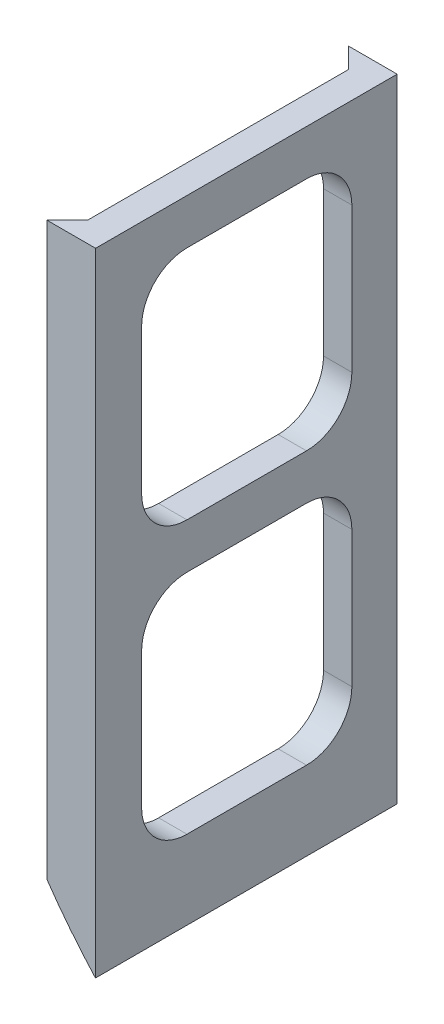
ISO-10303-21;
HEADER;
FILE_DESCRIPTION(('STEP AP214'),'2;1');
FILE_NAME('part.step','',(''),(''),'','','');
FILE_SCHEMA(('AUTOMOTIVE_DESIGN { 1 0 10303 214 1 1 1 1 }'));
ENDSEC;
DATA;
#1=APPLICATION_CONTEXT('core data for automotive mechanical design processes');
#2=APPLICATION_PROTOCOL_DEFINITION('international standard','automotive_design',2000,#1);
#3=PRODUCT_CONTEXT('',#1,'mechanical');
#4=PRODUCT('Part','Part','',(#3));
#5=PRODUCT_RELATED_PRODUCT_CATEGORY('part','',(#4));
#6=PRODUCT_DEFINITION_FORMATION('','',#4);
#7=PRODUCT_DEFINITION_CONTEXT('part definition',#1,'design');
#8=PRODUCT_DEFINITION('design','',#6,#7);
#9=PRODUCT_DEFINITION_SHAPE('','',#8);
#10=(LENGTH_UNIT() NAMED_UNIT(*) SI_UNIT(.MILLI.,.METRE.));
#11=(NAMED_UNIT(*) PLANE_ANGLE_UNIT() SI_UNIT($,.RADIAN.));
#12=(NAMED_UNIT(*) SI_UNIT($,.STERADIAN.) SOLID_ANGLE_UNIT());
#13=UNCERTAINTY_MEASURE_WITH_UNIT(LENGTH_MEASURE(1.E-05),#10,'distance_accuracy_value','');
#14=(GEOMETRIC_REPRESENTATION_CONTEXT(3) GLOBAL_UNCERTAINTY_ASSIGNED_CONTEXT((#13)) GLOBAL_UNIT_ASSIGNED_CONTEXT((#10,
#11,#12)) REPRESENTATION_CONTEXT('',''));
#15=CARTESIAN_POINT('',(0.,0.,0.));
#16=DIRECTION('',(0.,0.,1.));
#17=DIRECTION('',(1.,0.,0.));
#18=AXIS2_PLACEMENT_3D('',#15,#16,#17);
#19=CARTESIAN_POINT('',(0.,108.226514235445,0.));
#20=DIRECTION('',(0.,0.,-1.));
#21=DIRECTION('',(-1.,0.,0.));
#22=AXIS2_PLACEMENT_3D('',#19,#20,#21);
#23=PLANE('',#22);
#24=DIRECTION('',(0.,1.,0.));
#25=VECTOR('',#24,1.);
#26=CARTESIAN_POINT('',(39.4579888677549,108.226514235445,0.));
#27=LINE('',#26,#25);
#28=CARTESIAN_POINT('',(39.4579888677549,111.166966133927,0.));
#29=VERTEX_POINT('',#28);
#30=CARTESIAN_POINT('',(39.4579888677549,111.179894523592,0.));
#31=VERTEX_POINT('',#30);
#32=EDGE_CURVE('E277',#29,#31,#27,.T.);
#33=ORIENTED_EDGE('',*,*,#32,.F.);
#34=CARTESIAN_POINT('',(78.9720678383896,141.993156821472,0.));
#35=DIRECTION('',(0.,0.,-1.));
#36=DIRECTION('',(-1.,0.,0.));
#37=AXIS2_PLACEMENT_3D('',#34,#35,#36);
#38=CIRCLE('',#37,50.1160300622708);
#39=CARTESIAN_POINT('',(41.9392402705418,108.226514235445,0.));
#40=VERTEX_POINT('',#39);
#41=EDGE_CURVE('E466',#29,#40,#38,.F.);
#42=ORIENTED_EDGE('',*,*,#41,.T.);
#43=DIRECTION('',(-1.,0.,0.));
#44=VECTOR('',#43,1.);
#45=CARTESIAN_POINT('',(0.,108.226514235445,0.));
#46=LINE('',#45,#44);
#47=CARTESIAN_POINT('',(41.9572648481414,108.226514235445,0.));
#48=VERTEX_POINT('',#47);
#49=EDGE_CURVE('E263',#48,#40,#46,.T.);
#50=ORIENTED_EDGE('',*,*,#49,.F.);
#51=CARTESIAN_POINT('',(78.8744346483331,142.001580020937,0.));
#52=DIRECTION('',(0.,0.,1.));
#53=DIRECTION('',(1.,0.,0.));
#54=AXIS2_PLACEMENT_3D('',#51,#52,#53);
#55=CIRCLE('',#54,50.0363117632635);
#56=EDGE_CURVE('E296',#31,#48,#55,.T.);
#57=ORIENTED_EDGE('',*,*,#56,.F.);
#58=EDGE_LOOP('',(#33,#42,#50,#57));
#59=FACE_BOUND('',#58,.T.);
#60=ADVANCED_FACE('F41',(#59),#23,.F.);
#61=CARTESIAN_POINT('',(0.,108.226514235445,-1.79999999999999));
#62=DIRECTION('',(0.,0.,-1.));
#63=DIRECTION('',(-1.,0.,0.));
#64=AXIS2_PLACEMENT_3D('',#61,#62,#63);
#65=PLANE('',#64);
#66=CARTESIAN_POINT('',(78.9720678383896,141.993156821472,-1.8));
#67=DIRECTION('',(0.,0.,-1.));
#68=DIRECTION('',(1.,0.,0.));
#69=AXIS2_PLACEMENT_3D('',#66,#67,#68);
#70=CIRCLE('',#69,50.1160300622708);
#71=CARTESIAN_POINT('',(41.9392402705418,108.226514235445,-1.8));
#72=VERTEX_POINT('',#71);
#73=CARTESIAN_POINT('',(37.6579888677549,113.624805653126,-1.8));
#74=VERTEX_POINT('',#73);
#75=EDGE_CURVE('E58',#72,#74,#70,.T.);
#76=ORIENTED_EDGE('',*,*,#75,.T.);
#77=DIRECTION('',(0.,1.,0.));
#78=VECTOR('',#77,1.);
#79=CARTESIAN_POINT('',(37.6579888677549,108.226514235445,-1.8));
#80=LINE('',#79,#78);
#81=CARTESIAN_POINT('',(37.6579888677549,163.966514235445,-1.8));
#82=VERTEX_POINT('',#81);
#83=EDGE_CURVE('E280',#74,#82,#80,.T.);
#84=ORIENTED_EDGE('',*,*,#83,.T.);
#85=DIRECTION('',(-1.,0.,0.));
#86=VECTOR('',#85,1.);
#87=CARTESIAN_POINT('',(0.,163.966514235445,-1.79999999999999));
#88=LINE('',#87,#86);
#89=CARTESIAN_POINT('',(41.957988867755,163.966514235445,-1.8));
#90=VERTEX_POINT('',#89);
#91=EDGE_CURVE('E270',#90,#82,#88,.T.);
#92=ORIENTED_EDGE('',*,*,#91,.F.);
#93=DIRECTION('',(0.,1.,0.));
#94=VECTOR('',#93,1.);
#95=CARTESIAN_POINT('',(41.957988867755,108.226514235445,-1.8));
#96=LINE('',#95,#94);
#97=CARTESIAN_POINT('',(41.957988867755,108.226514235445,-1.8));
#98=VERTEX_POINT('',#97);
#99=EDGE_CURVE('E269',#98,#90,#96,.T.);
#100=ORIENTED_EDGE('',*,*,#99,.F.);
#101=DIRECTION('',(-1.,0.,0.));
#102=VECTOR('',#101,1.);
#103=CARTESIAN_POINT('',(0.,108.226514235445,-1.79999999999999));
#104=LINE('',#103,#102);
#105=EDGE_CURVE('E266',#98,#72,#104,.T.);
#106=ORIENTED_EDGE('',*,*,#105,.T.);
#107=EDGE_LOOP('',(#76,#84,#92,#100,#106));
#108=FACE_BOUND('',#107,.T.);
#109=ADVANCED_FACE('F477',(#108),#65,.T.);
#110=CARTESIAN_POINT('',(0.,108.226514235445,23.));
#111=DIRECTION('',(0.,0.,1.));
#112=DIRECTION('',(1.,0.,0.));
#113=AXIS2_PLACEMENT_3D('',#110,#111,#112);
#114=PLANE('',#113);
#115=DIRECTION('',(1.,0.,0.));
#116=VECTOR('',#115,1.);
#117=CARTESIAN_POINT('',(0.,108.226514235445,23.));
#118=LINE('',#117,#116);
#119=CARTESIAN_POINT('',(41.9392402705418,108.226514235445,23.));
#120=VERTEX_POINT('',#119);
#121=CARTESIAN_POINT('',(41.9572648481414,108.226514235445,23.));
#122=VERTEX_POINT('',#121);
#123=EDGE_CURVE('E255',#120,#122,#118,.T.);
#124=ORIENTED_EDGE('',*,*,#123,.F.);
#125=CARTESIAN_POINT('',(78.9720678383896,141.993156821472,23.));
#126=DIRECTION('',(0.,0.,1.));
#127=DIRECTION('',(1.,0.,0.));
#128=AXIS2_PLACEMENT_3D('',#125,#126,#127);
#129=CIRCLE('',#128,50.1160300622708);
#130=CARTESIAN_POINT('',(39.4579888677549,111.166966133927,23.));
#131=VERTEX_POINT('',#130);
#132=EDGE_CURVE('E66',#120,#131,#129,.F.);
#133=ORIENTED_EDGE('',*,*,#132,.T.);
#134=DIRECTION('',(0.,1.,0.));
#135=VECTOR('',#134,1.);
#136=CARTESIAN_POINT('',(39.4579888677549,108.226514235445,23.));
#137=LINE('',#136,#135);
#138=CARTESIAN_POINT('',(39.4579888677549,111.179894523592,23.));
#139=VERTEX_POINT('',#138);
#140=EDGE_CURVE('E239',#131,#139,#137,.T.);
#141=ORIENTED_EDGE('',*,*,#140,.T.);
#142=CARTESIAN_POINT('',(78.8744346483331,142.001580020937,23.));
#143=DIRECTION('',(0.,0.,1.));
#144=DIRECTION('',(1.,0.,0.));
#145=AXIS2_PLACEMENT_3D('',#142,#143,#144);
#146=CIRCLE('',#145,50.0363117632635);
#147=EDGE_CURVE('E288',#139,#122,#146,.T.);
#148=ORIENTED_EDGE('',*,*,#147,.T.);
#149=EDGE_LOOP('',(#124,#133,#141,#148));
#150=FACE_BOUND('',#149,.T.);
#151=ADVANCED_FACE('F515',(#150),#114,.F.);
#152=CARTESIAN_POINT('',(0.,108.226514235445,24.8));
#153=DIRECTION('',(0.,0.,-1.));
#154=DIRECTION('',(-1.,0.,0.));
#155=AXIS2_PLACEMENT_3D('',#152,#153,#154);
#156=PLANE('',#155);
#157=DIRECTION('',(0.,1.,0.));
#158=VECTOR('',#157,1.);
#159=CARTESIAN_POINT('',(37.6579888677549,108.226514235445,24.8));
#160=LINE('',#159,#158);
#161=CARTESIAN_POINT('',(37.6579866963459,113.624815972354,24.8000021714091));
#162=VERTEX_POINT('',#161);
#163=CARTESIAN_POINT('',(37.6579888677549,163.966514235445,24.8));
#164=VERTEX_POINT('',#163);
#165=EDGE_CURVE('E45',#162,#164,#160,.T.);
#166=ORIENTED_EDGE('',*,*,#165,.F.);
#167=CARTESIAN_POINT('',(78.9720678383896,141.993156821472,24.8));
#168=DIRECTION('',(0.,0.,-1.));
#169=DIRECTION('',(-1.,0.,0.));
#170=AXIS2_PLACEMENT_3D('',#167,#168,#169);
#171=CIRCLE('',#170,50.1160300622708);
#172=CARTESIAN_POINT('',(41.9392402705418,108.226514235445,24.8));
#173=VERTEX_POINT('',#172);
#174=EDGE_CURVE('E225',#162,#173,#171,.F.);
#175=ORIENTED_EDGE('',*,*,#174,.T.);
#176=DIRECTION('',(-1.,0.,0.));
#177=VECTOR('',#176,1.);
#178=CARTESIAN_POINT('',(0.,108.226514235445,24.8));
#179=LINE('',#178,#177);
#180=CARTESIAN_POINT('',(41.957988867755,108.226514235445,24.8));
#181=VERTEX_POINT('',#180);
#182=EDGE_CURVE('E250',#181,#173,#179,.T.);
#183=ORIENTED_EDGE('',*,*,#182,.F.);
#184=DIRECTION('',(0.,1.,0.));
#185=VECTOR('',#184,1.);
#186=CARTESIAN_POINT('',(41.957988867755,108.226514235445,24.8));
#187=LINE('',#186,#185);
#188=CARTESIAN_POINT('',(41.957988867755,163.966514235445,24.8));
#189=VERTEX_POINT('',#188);
#190=EDGE_CURVE('E247',#181,#189,#187,.T.);
#191=ORIENTED_EDGE('',*,*,#190,.T.);
#192=DIRECTION('',(-1.,0.,0.));
#193=VECTOR('',#192,1.);
#194=CARTESIAN_POINT('',(0.,163.966514235445,24.8));
#195=LINE('',#194,#193);
#196=EDGE_CURVE('E245',#189,#164,#195,.T.);
#197=ORIENTED_EDGE('',*,*,#196,.T.);
#198=EDGE_LOOP('',(#166,#175,#183,#191,#197));
#199=FACE_BOUND('',#198,.T.);
#200=ADVANCED_FACE('F242',(#199),#156,.F.);
#201=CARTESIAN_POINT('',(31.2289944338773,108.226514235445,31.2289944338776));
#202=DIRECTION('',(0.707106781186544,0.,0.707106781186551));
#203=DIRECTION('',(0.707106781186551,0.,-0.707106781186544));
#204=AXIS2_PLACEMENT_3D('',#201,#202,#203);
#205=PLANE('',#204);
#206=ORIENTED_EDGE('',*,*,#140,.F.);
#207=CARTESIAN_POINT('',(78.9720678383896,141.993156821472,-16.5140789706343));
#208=DIRECTION('',(0.707106781186544,0.,0.707106781186551));
#209=DIRECTION('',(-0.707106781186551,0.,0.707106781186544));
#210=AXIS2_PLACEMENT_3D('',#207,#208,#209);
#211=ELLIPSE('',#210,70.8747694063607,50.1160300622708);
#212=EDGE_CURVE('E228',#131,#162,#211,.F.);
#213=ORIENTED_EDGE('',*,*,#212,.T.);
#214=ORIENTED_EDGE('',*,*,#165,.T.);
#215=DIRECTION('',(0.707106781186551,0.,-0.707106781186544));
#216=VECTOR('',#215,1.);
#217=CARTESIAN_POINT('',(31.2289944338773,163.966514235445,31.2289944338776));
#218=LINE('',#217,#216);
#219=CARTESIAN_POINT('',(39.4579888677549,163.966514235445,23.));
#220=VERTEX_POINT('',#219);
#221=EDGE_CURVE('E279',#164,#220,#218,.T.);
#222=ORIENTED_EDGE('',*,*,#221,.T.);
#223=DIRECTION('',(0.,-1.,0.));
#224=VECTOR('',#223,1.);
#225=CARTESIAN_POINT('',(39.4579888677549,163.966514235445,23.));
#226=LINE('',#225,#224);
#227=EDGE_CURVE('E284',#220,#139,#226,.T.);
#228=ORIENTED_EDGE('',*,*,#227,.T.);
#229=EDGE_LOOP('',(#206,#213,#214,#222,#228));
#230=FACE_BOUND('',#229,.T.);
#231=ADVANCED_FACE('F235',(#230),#205,.F.);
#232=CARTESIAN_POINT('',(78.8744346483331,142.001580020937,0.));
#233=DIRECTION('',(0.,0.,1.));
#234=DIRECTION('',(1.,0.,0.));
#235=AXIS2_PLACEMENT_3D('',#232,#233,#234);
#236=PLANE('',#235);
#237=CARTESIAN_POINT('',(41.957988867755,108.226514235445,0.));
#238=VERTEX_POINT('',#237);
#239=EDGE_CURVE('E259',#238,#48,#46,.T.);
#240=ORIENTED_EDGE('',*,*,#239,.F.);
#241=DIRECTION('',(0.,1.,0.));
#242=VECTOR('',#241,1.);
#243=CARTESIAN_POINT('',(41.957988867755,163.966514235445,0.));
#244=LINE('',#243,#242);
#245=CARTESIAN_POINT('',(41.9579888677549,108.225722877111,0.));
#246=VERTEX_POINT('',#245);
#247=EDGE_CURVE('E287',#246,#238,#244,.T.);
#248=ORIENTED_EDGE('',*,*,#247,.F.);
#249=EDGE_CURVE('E295',#48,#246,#55,.T.);
#250=ORIENTED_EDGE('',*,*,#249,.F.);
#251=EDGE_LOOP('',(#240,#248,#250));
#252=FACE_BOUND('',#251,.T.);
#253=ADVANCED_FACE('F497',(#252),#236,.F.);
#254=CARTESIAN_POINT('',(39.4579888677549,163.966514235445,23.));
#255=DIRECTION('',(0.,-1.,0.));
#256=DIRECTION('',(0.,0.,-1.));
#257=AXIS2_PLACEMENT_3D('',#254,#255,#256);
#258=PLANE('',#257);
#259=DIRECTION('',(0.,0.,-1.));
#260=VECTOR('',#259,1.);
#261=CARTESIAN_POINT('',(41.957988867755,163.966514235445,23.));
#262=LINE('',#261,#260);
#263=EDGE_CURVE('E292',#189,#90,#262,.T.);
#264=ORIENTED_EDGE('',*,*,#263,.T.);
#265=ORIENTED_EDGE('',*,*,#91,.T.);
#266=DIRECTION('',(0.707106781186551,0.,0.707106781186544));
#267=VECTOR('',#266,1.);
#268=CARTESIAN_POINT('',(19.7289944338773,163.966514235445,-19.7289944338775));
#269=LINE('',#268,#267);
#270=CARTESIAN_POINT('',(39.4579888677549,163.966514235445,0.));
#271=VERTEX_POINT('',#270);
#272=EDGE_CURVE('E273',#82,#271,#269,.T.);
#273=ORIENTED_EDGE('',*,*,#272,.T.);
#274=DIRECTION('',(0.,0.,-1.));
#275=VECTOR('',#274,1.);
#276=CARTESIAN_POINT('',(39.4579888677549,163.966514235445,23.));
#277=LINE('',#276,#275);
#278=EDGE_CURVE('E307',#220,#271,#277,.T.);
#279=ORIENTED_EDGE('',*,*,#278,.F.);
#280=ORIENTED_EDGE('',*,*,#221,.F.);
#281=ORIENTED_EDGE('',*,*,#196,.F.);
#282=EDGE_LOOP('',(#264,#265,#273,#279,#280,#281));
#283=FACE_BOUND('',#282,.T.);
#284=ADVANCED_FACE('F43',(#283),#258,.F.);
#285=CARTESIAN_POINT('',(39.4579888677549,163.966514235445,23.));
#286=DIRECTION('',(1.,0.,0.));
#287=DIRECTION('',(0.,0.,-1.));
#288=AXIS2_PLACEMENT_3D('',#285,#286,#287);
#289=PLANE('',#288);
#290=DIRECTION('',(0.,-1.,0.));
#291=VECTOR('',#290,1.);
#292=CARTESIAN_POINT('',(39.4579888677549,163.966514235445,20.7386632397786));
#293=LINE('',#292,#291);
#294=CARTESIAN_POINT('',(39.4579888677549,131.19142938987,20.7386632397786));
#295=VERTEX_POINT('',#294);
#296=CARTESIAN_POINT('',(39.4579888677549,119.179894523592,20.7386632397786));
#297=VERTEX_POINT('',#296);
#298=EDGE_CURVE('E343',#295,#297,#293,.T.);
#299=ORIENTED_EDGE('',*,*,#298,.T.);
#300=CARTESIAN_POINT('',(39.4579888677549,119.179894523592,16.7386632397786));
#301=DIRECTION('',(1.,0.,0.));
#302=DIRECTION('',(0.,0.,-1.));
#303=AXIS2_PLACEMENT_3D('',#300,#301,#302);
#304=CIRCLE('',#303,4.);
#305=CARTESIAN_POINT('',(39.4579888677549,115.179894523592,16.7386632397786));
#306=VERTEX_POINT('',#305);
#307=EDGE_CURVE('E274',#297,#306,#304,.T.);
#308=ORIENTED_EDGE('',*,*,#307,.T.);
#309=DIRECTION('',(0.,0.,-1.));
#310=VECTOR('',#309,1.);
#311=CARTESIAN_POINT('',(39.4579888677549,115.179894523592,23.));
#312=LINE('',#311,#310);
#313=CARTESIAN_POINT('',(39.4579888677549,115.179894523592,6.19612482537011));
#314=VERTEX_POINT('',#313);
#315=EDGE_CURVE('E325',#306,#314,#312,.T.);
#316=ORIENTED_EDGE('',*,*,#315,.T.);
#317=CARTESIAN_POINT('',(39.4579888677549,119.179894523592,6.19612482537008));
#318=DIRECTION('',(1.,0.,0.));
#319=DIRECTION('',(0.,0.,-1.));
#320=AXIS2_PLACEMENT_3D('',#317,#318,#319);
#321=CIRCLE('',#320,4.);
#322=CARTESIAN_POINT('',(39.4579888677549,119.179894523592,2.19612482537008));
#323=VERTEX_POINT('',#322);
#324=EDGE_CURVE('E328',#314,#323,#321,.T.);
#325=ORIENTED_EDGE('',*,*,#324,.T.);
#326=DIRECTION('',(0.,1.,0.));
#327=VECTOR('',#326,1.);
#328=CARTESIAN_POINT('',(39.4579888677549,163.966514235445,2.19612482537007));
#329=LINE('',#328,#327);
#330=CARTESIAN_POINT('',(39.4579888677549,131.19142938987,2.19612482537007));
#331=VERTEX_POINT('',#330);
#332=EDGE_CURVE('E331',#323,#331,#329,.T.);
#333=ORIENTED_EDGE('',*,*,#332,.T.);
#334=CARTESIAN_POINT('',(39.4579888677549,131.19142938987,6.19612482537008));
#335=DIRECTION('',(1.,0.,0.));
#336=DIRECTION('',(0.,0.,-1.));
#337=AXIS2_PLACEMENT_3D('',#334,#335,#336);
#338=CIRCLE('',#337,4.);
#339=CARTESIAN_POINT('',(39.4579888677549,135.19142938987,6.1961248253701));
#340=VERTEX_POINT('',#339);
#341=EDGE_CURVE('E334',#331,#340,#338,.T.);
#342=ORIENTED_EDGE('',*,*,#341,.T.);
#343=DIRECTION('',(0.,0.,1.));
#344=VECTOR('',#343,1.);
#345=CARTESIAN_POINT('',(39.4579888677549,135.19142938987,23.));
#346=LINE('',#345,#344);
#347=CARTESIAN_POINT('',(39.4579888677549,135.19142938987,16.7386632397786));
#348=VERTEX_POINT('',#347);
#349=EDGE_CURVE('E337',#340,#348,#346,.T.);
#350=ORIENTED_EDGE('',*,*,#349,.T.);
#351=CARTESIAN_POINT('',(39.4579888677549,131.19142938987,16.7386632397786));
#352=DIRECTION('',(1.,0.,0.));
#353=DIRECTION('',(0.,0.,-1.));
#354=AXIS2_PLACEMENT_3D('',#351,#352,#353);
#355=CIRCLE('',#354,4.);
#356=EDGE_CURVE('E340',#348,#295,#355,.T.);
#357=ORIENTED_EDGE('',*,*,#356,.T.);
#358=EDGE_LOOP('',(#299,#308,#316,#325,#333,#342,#350,#357));
#359=FACE_BOUND('',#358,.T.);
#360=DIRECTION('',(0.,1.,0.));
#361=VECTOR('',#360,1.);
#362=CARTESIAN_POINT('',(39.4579888677549,163.966514235445,2.19612482537007));
#363=LINE('',#362,#361);
#364=CARTESIAN_POINT('',(39.4579888677549,143.19142938987,2.19612482537007));
#365=VERTEX_POINT('',#364);
#366=CARTESIAN_POINT('',(39.4579888677549,155.966514235445,2.19612482537007));
#367=VERTEX_POINT('',#366);
#368=EDGE_CURVE('E367',#365,#367,#363,.T.);
#369=ORIENTED_EDGE('',*,*,#368,.T.);
#370=CARTESIAN_POINT('',(39.4579888677549,155.966514235445,6.19612482537007));
#371=DIRECTION('',(1.,0.,0.));
#372=DIRECTION('',(0.,0.,-1.));
#373=AXIS2_PLACEMENT_3D('',#370,#371,#372);
#374=CIRCLE('',#373,4.);
#375=CARTESIAN_POINT('',(39.4579888677549,159.966514235445,6.1961248253701));
#376=VERTEX_POINT('',#375);
#377=EDGE_CURVE('E346',#367,#376,#374,.T.);
#378=ORIENTED_EDGE('',*,*,#377,.T.);
#379=DIRECTION('',(0.,0.,1.));
#380=VECTOR('',#379,1.);
#381=CARTESIAN_POINT('',(39.4579888677549,159.966514235445,23.));
#382=LINE('',#381,#380);
#383=CARTESIAN_POINT('',(39.4579888677549,159.966514235445,16.7386632397786));
#384=VERTEX_POINT('',#383);
#385=EDGE_CURVE('E349',#376,#384,#382,.T.);
#386=ORIENTED_EDGE('',*,*,#385,.T.);
#387=CARTESIAN_POINT('',(39.4579888677549,155.966514235445,16.7386632397786));
#388=DIRECTION('',(1.,0.,0.));
#389=DIRECTION('',(0.,0.,-1.));
#390=AXIS2_PLACEMENT_3D('',#387,#388,#389);
#391=CIRCLE('',#390,4.);
#392=CARTESIAN_POINT('',(39.4579888677549,155.966514235445,20.7386632397786));
#393=VERTEX_POINT('',#392);
#394=EDGE_CURVE('E352',#384,#393,#391,.T.);
#395=ORIENTED_EDGE('',*,*,#394,.T.);
#396=DIRECTION('',(0.,-1.,0.));
#397=VECTOR('',#396,1.);
#398=CARTESIAN_POINT('',(39.4579888677549,163.966514235445,20.7386632397786));
#399=LINE('',#398,#397);
#400=CARTESIAN_POINT('',(39.4579888677549,143.19142938987,20.7386632397786));
#401=VERTEX_POINT('',#400);
#402=EDGE_CURVE('E355',#393,#401,#399,.T.);
#403=ORIENTED_EDGE('',*,*,#402,.T.);
#404=CARTESIAN_POINT('',(39.4579888677549,143.19142938987,16.7386632397786));
#405=DIRECTION('',(1.,0.,0.));
#406=DIRECTION('',(0.,0.,-1.));
#407=AXIS2_PLACEMENT_3D('',#404,#405,#406);
#408=CIRCLE('',#407,4.);
#409=CARTESIAN_POINT('',(39.4579888677549,139.19142938987,16.7386632397786));
#410=VERTEX_POINT('',#409);
#411=EDGE_CURVE('E358',#401,#410,#408,.T.);
#412=ORIENTED_EDGE('',*,*,#411,.T.);
#413=DIRECTION('',(0.,0.,-1.));
#414=VECTOR('',#413,1.);
#415=CARTESIAN_POINT('',(39.4579888677549,139.19142938987,23.));
#416=LINE('',#415,#414);
#417=CARTESIAN_POINT('',(39.4579888677549,139.19142938987,6.1961248253701));
#418=VERTEX_POINT('',#417);
#419=EDGE_CURVE('E361',#410,#418,#416,.T.);
#420=ORIENTED_EDGE('',*,*,#419,.T.);
#421=CARTESIAN_POINT('',(39.4579888677549,143.19142938987,6.19612482537008));
#422=DIRECTION('',(1.,0.,0.));
#423=DIRECTION('',(0.,0.,-1.));
#424=AXIS2_PLACEMENT_3D('',#421,#422,#423);
#425=CIRCLE('',#424,4.);
#426=EDGE_CURVE('E364',#418,#365,#425,.T.);
#427=ORIENTED_EDGE('',*,*,#426,.T.);
#428=EDGE_LOOP('',(#369,#378,#386,#395,#403,#412,#420,#427));
#429=FACE_BOUND('',#428,.T.);
#430=DIRECTION('',(0.,-1.,0.));
#431=VECTOR('',#430,1.);
#432=CARTESIAN_POINT('',(39.4579888677549,163.966514235445,0.));
#433=LINE('',#432,#431);
#434=EDGE_CURVE('E248',#271,#31,#433,.T.);
#435=ORIENTED_EDGE('',*,*,#434,.T.);
#436=DIRECTION('',(0.,0.,-1.));
#437=VECTOR('',#436,1.);
#438=CARTESIAN_POINT('',(39.4579888677549,111.179894523592,23.));
#439=LINE('',#438,#437);
#440=EDGE_CURVE('E304',#139,#31,#439,.T.);
#441=ORIENTED_EDGE('',*,*,#440,.F.);
#442=ORIENTED_EDGE('',*,*,#227,.F.);
#443=ORIENTED_EDGE('',*,*,#278,.T.);
#444=EDGE_LOOP('',(#435,#441,#442,#443));
#445=FACE_BOUND('',#444,.T.);
#446=ADVANCED_FACE('F530',(#359,#429,#445),#289,.F.);
#447=CARTESIAN_POINT('',(78.8744346483331,142.001580020937,23.));
#448=DIRECTION('',(0.,0.,-1.));
#449=DIRECTION('',(-1.,0.,0.));
#450=AXIS2_PLACEMENT_3D('',#447,#448,#449);
#451=CYLINDRICAL_SURFACE('',#450,50.0363117632635);
#452=ORIENTED_EDGE('',*,*,#56,.T.);
#453=ORIENTED_EDGE('',*,*,#249,.T.);
#454=DIRECTION('',(0.,0.,-1.));
#455=VECTOR('',#454,1.);
#456=CARTESIAN_POINT('',(41.9579888677549,108.225722877111,23.));
#457=LINE('',#456,#455);
#458=CARTESIAN_POINT('',(41.9579888677549,108.225722877111,23.));
#459=VERTEX_POINT('',#458);
#460=EDGE_CURVE('E301',#459,#246,#457,.T.);
#461=ORIENTED_EDGE('',*,*,#460,.F.);
#462=EDGE_CURVE('E286',#122,#459,#146,.T.);
#463=ORIENTED_EDGE('',*,*,#462,.F.);
#464=ORIENTED_EDGE('',*,*,#147,.F.);
#465=ORIENTED_EDGE('',*,*,#440,.T.);
#466=EDGE_LOOP('',(#452,#453,#461,#463,#464,#465));
#467=FACE_BOUND('',#466,.T.);
#468=ADVANCED_FACE('F527',(#467),#451,.T.);
#469=CARTESIAN_POINT('',(41.957988867755,163.966514235445,23.));
#470=DIRECTION('',(-1.,0.,0.));
#471=DIRECTION('',(0.,0.,1.));
#472=AXIS2_PLACEMENT_3D('',#469,#470,#471);
#473=PLANE('',#472);
#474=DIRECTION('',(0.,0.,1.));
#475=VECTOR('',#474,1.);
#476=CARTESIAN_POINT('',(41.957988867755,115.179894523592,16.7386632397786));
#477=LINE('',#476,#475);
#478=CARTESIAN_POINT('',(41.957988867755,115.179894523592,6.19612482537011));
#479=VERTEX_POINT('',#478);
#480=CARTESIAN_POINT('',(41.957988867755,115.179894523592,16.7386632397786));
#481=VERTEX_POINT('',#480);
#482=EDGE_CURVE('E423',#479,#481,#477,.T.);
#483=ORIENTED_EDGE('',*,*,#482,.T.);
#484=CARTESIAN_POINT('',(41.957988867755,119.179894523592,16.7386632397786));
#485=DIRECTION('',(-1.,0.,0.));
#486=DIRECTION('',(0.,0.,-1.));
#487=AXIS2_PLACEMENT_3D('',#484,#485,#486);
#488=CIRCLE('',#487,4.);
#489=CARTESIAN_POINT('',(41.957988867755,119.179894523592,20.7386632397786));
#490=VERTEX_POINT('',#489);
#491=EDGE_CURVE('E374',#481,#490,#488,.T.);
#492=ORIENTED_EDGE('',*,*,#491,.T.);
#493=DIRECTION('',(0.,1.,0.));
#494=VECTOR('',#493,1.);
#495=CARTESIAN_POINT('',(41.957988867755,131.19142938987,20.7386632397786));
#496=LINE('',#495,#494);
#497=CARTESIAN_POINT('',(41.957988867755,131.19142938987,20.7386632397786));
#498=VERTEX_POINT('',#497);
#499=EDGE_CURVE('E460',#490,#498,#496,.T.);
#500=ORIENTED_EDGE('',*,*,#499,.T.);
#501=CARTESIAN_POINT('',(41.957988867755,131.19142938987,16.7386632397786));
#502=DIRECTION('',(-1.,0.,0.));
#503=DIRECTION('',(0.,0.,-1.));
#504=AXIS2_PLACEMENT_3D('',#501,#502,#503);
#505=CIRCLE('',#504,4.);
#506=CARTESIAN_POINT('',(41.957988867755,135.19142938987,16.7386632397786));
#507=VERTEX_POINT('',#506);
#508=EDGE_CURVE('E457',#498,#507,#505,.T.);
#509=ORIENTED_EDGE('',*,*,#508,.T.);
#510=DIRECTION('',(0.,0.,-1.));
#511=VECTOR('',#510,1.);
#512=CARTESIAN_POINT('',(41.957988867755,135.19142938987,16.7386632397786));
#513=LINE('',#512,#511);
#514=CARTESIAN_POINT('',(41.957988867755,135.19142938987,6.1961248253701));
#515=VERTEX_POINT('',#514);
#516=EDGE_CURVE('E454',#507,#515,#513,.T.);
#517=ORIENTED_EDGE('',*,*,#516,.T.);
#518=CARTESIAN_POINT('',(41.957988867755,131.19142938987,6.19612482537008));
#519=DIRECTION('',(-1.,0.,0.));
#520=DIRECTION('',(0.,0.,1.));
#521=AXIS2_PLACEMENT_3D('',#518,#519,#520);
#522=CIRCLE('',#521,4.);
#523=CARTESIAN_POINT('',(41.957988867755,131.19142938987,2.19612482537007));
#524=VERTEX_POINT('',#523);
#525=EDGE_CURVE('E451',#515,#524,#522,.T.);
#526=ORIENTED_EDGE('',*,*,#525,.T.);
#527=DIRECTION('',(0.,-1.,0.));
#528=VECTOR('',#527,1.);
#529=CARTESIAN_POINT('',(41.957988867755,131.19142938987,2.19612482537008));
#530=LINE('',#529,#528);
#531=CARTESIAN_POINT('',(41.957988867755,119.179894523592,2.19612482537008));
#532=VERTEX_POINT('',#531);
#533=EDGE_CURVE('E448',#524,#532,#530,.T.);
#534=ORIENTED_EDGE('',*,*,#533,.T.);
#535=CARTESIAN_POINT('',(41.957988867755,119.179894523592,6.19612482537008));
#536=DIRECTION('',(-1.,0.,0.));
#537=DIRECTION('',(0.,0.,-1.));
#538=AXIS2_PLACEMENT_3D('',#535,#536,#537);
#539=CIRCLE('',#538,4.);
#540=EDGE_CURVE('E445',#532,#479,#539,.T.);
#541=ORIENTED_EDGE('',*,*,#540,.T.);
#542=EDGE_LOOP('',(#483,#492,#500,#509,#517,#526,#534,#541));
#543=FACE_BOUND('',#542,.T.);
#544=DIRECTION('',(0.,0.,-1.));
#545=VECTOR('',#544,1.);
#546=CARTESIAN_POINT('',(41.957988867755,159.966514235445,6.1961248253701));
#547=LINE('',#546,#545);
#548=CARTESIAN_POINT('',(41.957988867755,159.966514235445,16.7386632397786));
#549=VERTEX_POINT('',#548);
#550=CARTESIAN_POINT('',(41.957988867755,159.966514235445,6.1961248253701));
#551=VERTEX_POINT('',#550);
#552=EDGE_CURVE('E393',#549,#551,#547,.T.);
#553=ORIENTED_EDGE('',*,*,#552,.T.);
#554=CARTESIAN_POINT('',(41.957988867755,155.966514235445,6.19612482537007));
#555=DIRECTION('',(-1.,0.,0.));
#556=DIRECTION('',(0.,0.,1.));
#557=AXIS2_PLACEMENT_3D('',#554,#555,#556);
#558=CIRCLE('',#557,4.);
#559=CARTESIAN_POINT('',(41.957988867755,155.966514235445,2.19612482537007));
#560=VERTEX_POINT('',#559);
#561=EDGE_CURVE('E371',#551,#560,#558,.T.);
#562=ORIENTED_EDGE('',*,*,#561,.T.);
#563=DIRECTION('',(0.,-1.,0.));
#564=VECTOR('',#563,1.);
#565=CARTESIAN_POINT('',(41.957988867755,155.966514235445,2.19612482537007));
#566=LINE('',#565,#564);
#567=CARTESIAN_POINT('',(41.957988867755,143.19142938987,2.19612482537007));
#568=VERTEX_POINT('',#567);
#569=EDGE_CURVE('E375',#560,#568,#566,.T.);
#570=ORIENTED_EDGE('',*,*,#569,.T.);
#571=CARTESIAN_POINT('',(41.957988867755,143.19142938987,6.19612482537008));
#572=DIRECTION('',(-1.,0.,0.));
#573=DIRECTION('',(0.,0.,1.));
#574=AXIS2_PLACEMENT_3D('',#571,#572,#573);
#575=CIRCLE('',#574,4.);
#576=CARTESIAN_POINT('',(41.957988867755,139.19142938987,6.1961248253701));
#577=VERTEX_POINT('',#576);
#578=EDGE_CURVE('E378',#568,#577,#575,.T.);
#579=ORIENTED_EDGE('',*,*,#578,.T.);
#580=DIRECTION('',(0.,0.,1.));
#581=VECTOR('',#580,1.);
#582=CARTESIAN_POINT('',(41.957988867755,139.19142938987,6.1961248253701));
#583=LINE('',#582,#581);
#584=CARTESIAN_POINT('',(41.957988867755,139.19142938987,16.7386632397786));
#585=VERTEX_POINT('',#584);
#586=EDGE_CURVE('E381',#577,#585,#583,.T.);
#587=ORIENTED_EDGE('',*,*,#586,.T.);
#588=CARTESIAN_POINT('',(41.957988867755,143.19142938987,16.7386632397786));
#589=DIRECTION('',(-1.,0.,0.));
#590=DIRECTION('',(0.,0.,1.));
#591=AXIS2_PLACEMENT_3D('',#588,#589,#590);
#592=CIRCLE('',#591,4.);
#593=CARTESIAN_POINT('',(41.957988867755,143.19142938987,20.7386632397786));
#594=VERTEX_POINT('',#593);
#595=EDGE_CURVE('E384',#585,#594,#592,.T.);
#596=ORIENTED_EDGE('',*,*,#595,.T.);
#597=DIRECTION('',(0.,1.,0.));
#598=VECTOR('',#597,1.);
#599=CARTESIAN_POINT('',(41.957988867755,155.966514235445,20.7386632397786));
#600=LINE('',#599,#598);
#601=CARTESIAN_POINT('',(41.957988867755,155.966514235445,20.7386632397786));
#602=VERTEX_POINT('',#601);
#603=EDGE_CURVE('E387',#594,#602,#600,.T.);
#604=ORIENTED_EDGE('',*,*,#603,.T.);
#605=CARTESIAN_POINT('',(41.957988867755,155.966514235445,16.7386632397786));
#606=DIRECTION('',(-1.,0.,0.));
#607=DIRECTION('',(0.,0.,-1.));
#608=AXIS2_PLACEMENT_3D('',#605,#606,#607);
#609=CIRCLE('',#608,4.);
#610=EDGE_CURVE('E390',#602,#549,#609,.T.);
#611=ORIENTED_EDGE('',*,*,#610,.T.);
#612=EDGE_LOOP('',(#553,#562,#570,#579,#587,#596,#604,#611));
#613=FACE_BOUND('',#612,.T.);
#614=ORIENTED_EDGE('',*,*,#247,.T.);
#615=DIRECTION('',(0.,0.,-1.));
#616=VECTOR('',#615,1.);
#617=CARTESIAN_POINT('',(41.957988867755,108.226514235445,0.));
#618=LINE('',#617,#616);
#619=EDGE_CURVE('E262',#238,#98,#618,.T.);
#620=ORIENTED_EDGE('',*,*,#619,.T.);
#621=ORIENTED_EDGE('',*,*,#99,.T.);
#622=ORIENTED_EDGE('',*,*,#263,.F.);
#623=ORIENTED_EDGE('',*,*,#190,.F.);
#624=DIRECTION('',(0.,0.,1.));
#625=VECTOR('',#624,1.);
#626=CARTESIAN_POINT('',(41.957988867755,108.226514235445,0.));
#627=LINE('',#626,#625);
#628=CARTESIAN_POINT('',(41.957988867755,108.226514235445,23.));
#629=VERTEX_POINT('',#628);
#630=EDGE_CURVE('E318',#629,#181,#627,.T.);
#631=ORIENTED_EDGE('',*,*,#630,.F.);
#632=DIRECTION('',(0.,1.,0.));
#633=VECTOR('',#632,1.);
#634=CARTESIAN_POINT('',(41.957988867755,163.966514235445,23.));
#635=LINE('',#634,#633);
#636=EDGE_CURVE('E290',#459,#629,#635,.T.);
#637=ORIENTED_EDGE('',*,*,#636,.F.);
#638=ORIENTED_EDGE('',*,*,#460,.T.);
#639=EDGE_LOOP('',(#614,#620,#621,#622,#623,#631,#637,#638));
#640=FACE_BOUND('',#639,.T.);
#641=ADVANCED_FACE('F491',(#543,#613,#640),#473,.F.);
#642=CARTESIAN_POINT('',(78.8744346483331,142.001580020937,23.));
#643=DIRECTION('',(0.,0.,1.));
#644=DIRECTION('',(1.,0.,0.));
#645=AXIS2_PLACEMENT_3D('',#642,#643,#644);
#646=PLANE('',#645);
#647=EDGE_CURVE('E51',#122,#629,#118,.T.);
#648=ORIENTED_EDGE('',*,*,#647,.F.);
#649=ORIENTED_EDGE('',*,*,#462,.T.);
#650=ORIENTED_EDGE('',*,*,#636,.T.);
#651=EDGE_LOOP('',(#648,#649,#650));
#652=FACE_BOUND('',#651,.T.);
#653=ADVANCED_FACE('F519',(#652),#646,.T.);
#654=CARTESIAN_POINT('',(19.7289944338773,108.226514235445,-19.7289944338775));
#655=DIRECTION('',(-0.707106781186544,0.,0.707106781186551));
#656=DIRECTION('',(0.707106781186551,0.,0.707106781186544));
#657=AXIS2_PLACEMENT_3D('',#654,#655,#656);
#658=PLANE('',#657);
#659=CARTESIAN_POINT('',(78.9720678383896,141.993156821472,39.5140789706343));
#660=DIRECTION('',(-0.707106781186544,0.,0.707106781186551));
#661=DIRECTION('',(0.707106781186551,0.,0.707106781186544));
#662=AXIS2_PLACEMENT_3D('',#659,#660,#661);
#663=ELLIPSE('',#662,70.8747694063607,50.1160300622708);
#664=EDGE_CURVE('E401',#29,#74,#663,.F.);
#665=ORIENTED_EDGE('',*,*,#664,.F.);
#666=ORIENTED_EDGE('',*,*,#32,.T.);
#667=ORIENTED_EDGE('',*,*,#434,.F.);
#668=ORIENTED_EDGE('',*,*,#272,.F.);
#669=ORIENTED_EDGE('',*,*,#83,.F.);
#670=EDGE_LOOP('',(#665,#666,#667,#668,#669));
#671=FACE_BOUND('',#670,.T.);
#672=ADVANCED_FACE('F483',(#671),#658,.T.);
#673=CARTESIAN_POINT('',(0.,108.226514235445,0.));
#674=DIRECTION('',(0.,1.,0.));
#675=DIRECTION('',(0.,0.,1.));
#676=AXIS2_PLACEMENT_3D('',#673,#674,#675);
#677=PLANE('',#676);
#678=ORIENTED_EDGE('',*,*,#49,.T.);
#679=DIRECTION('',(0.,0.,1.));
#680=VECTOR('',#679,1.);
#681=CARTESIAN_POINT('',(41.9392402705418,108.226514235445,-1.8));
#682=LINE('',#681,#680);
#683=EDGE_CURVE('E240',#40,#72,#682,.F.);
#684=ORIENTED_EDGE('',*,*,#683,.T.);
#685=ORIENTED_EDGE('',*,*,#105,.F.);
#686=ORIENTED_EDGE('',*,*,#619,.F.);
#687=ORIENTED_EDGE('',*,*,#239,.T.);
#688=EDGE_LOOP('',(#678,#684,#685,#686,#687));
#689=FACE_BOUND('',#688,.T.);
#690=ADVANCED_FACE('F490',(#689),#677,.F.);
#691=CARTESIAN_POINT('',(0.,108.226514235445,0.));
#692=DIRECTION('',(0.,1.,0.));
#693=DIRECTION('',(0.,0.,1.));
#694=AXIS2_PLACEMENT_3D('',#691,#692,#693);
#695=PLANE('',#694);
#696=ORIENTED_EDGE('',*,*,#182,.T.);
#697=DIRECTION('',(0.,0.,1.));
#698=VECTOR('',#697,1.);
#699=CARTESIAN_POINT('',(41.9392402705418,108.226514235445,-1.8));
#700=LINE('',#699,#698);
#701=EDGE_CURVE('E11',#173,#120,#700,.F.);
#702=ORIENTED_EDGE('',*,*,#701,.T.);
#703=ORIENTED_EDGE('',*,*,#123,.T.);
#704=ORIENTED_EDGE('',*,*,#647,.T.);
#705=ORIENTED_EDGE('',*,*,#630,.T.);
#706=EDGE_LOOP('',(#696,#702,#703,#704,#705));
#707=FACE_BOUND('',#706,.T.);
#708=ADVANCED_FACE('F541',(#707),#695,.F.);
#709=CARTESIAN_POINT('',(41.957988867755,155.966514235445,6.19612482537007));
#710=DIRECTION('',(-1.,0.,0.));
#711=DIRECTION('',(0.,0.,1.));
#712=AXIS2_PLACEMENT_3D('',#709,#710,#711);
#713=CYLINDRICAL_SURFACE('',#712,4.);
#714=DIRECTION('',(-1.,0.,0.));
#715=VECTOR('',#714,1.);
#716=CARTESIAN_POINT('',(41.957988867755,155.966514235445,2.19612482537007));
#717=LINE('',#716,#715);
#718=EDGE_CURVE('E396',#560,#367,#717,.T.);
#719=ORIENTED_EDGE('',*,*,#718,.F.);
#720=ORIENTED_EDGE('',*,*,#561,.F.);
#721=DIRECTION('',(-1.,0.,0.));
#722=VECTOR('',#721,1.);
#723=CARTESIAN_POINT('',(41.957988867755,159.966514235445,6.1961248253701));
#724=LINE('',#723,#722);
#725=EDGE_CURVE('E397',#551,#376,#724,.T.);
#726=ORIENTED_EDGE('',*,*,#725,.T.);
#727=ORIENTED_EDGE('',*,*,#377,.F.);
#728=EDGE_LOOP('',(#719,#720,#726,#727));
#729=FACE_BOUND('',#728,.T.);
#730=ADVANCED_FACE('F569',(#729),#713,.F.);
#731=CARTESIAN_POINT('',(41.957988867755,159.966514235445,6.1961248253701));
#732=DIRECTION('',(0.,1.,0.));
#733=DIRECTION('',(0.,0.,1.));
#734=AXIS2_PLACEMENT_3D('',#731,#732,#733);
#735=PLANE('',#734);
#736=ORIENTED_EDGE('',*,*,#725,.F.);
#737=ORIENTED_EDGE('',*,*,#552,.F.);
#738=DIRECTION('',(-1.,0.,0.));
#739=VECTOR('',#738,1.);
#740=CARTESIAN_POINT('',(41.957988867755,159.966514235445,16.7386632397786));
#741=LINE('',#740,#739);
#742=EDGE_CURVE('E400',#549,#384,#741,.T.);
#743=ORIENTED_EDGE('',*,*,#742,.T.);
#744=ORIENTED_EDGE('',*,*,#385,.F.);
#745=EDGE_LOOP('',(#736,#737,#743,#744));
#746=FACE_BOUND('',#745,.T.);
#747=ADVANCED_FACE('F733',(#746),#735,.F.);
#748=CARTESIAN_POINT('',(41.957988867755,155.966514235445,16.7386632397786));
#749=DIRECTION('',(-1.,0.,0.));
#750=DIRECTION('',(0.,0.,1.));
#751=AXIS2_PLACEMENT_3D('',#748,#749,#750);
#752=CYLINDRICAL_SURFACE('',#751,4.);
#753=ORIENTED_EDGE('',*,*,#742,.F.);
#754=ORIENTED_EDGE('',*,*,#610,.F.);
#755=DIRECTION('',(-1.,0.,0.));
#756=VECTOR('',#755,1.);
#757=CARTESIAN_POINT('',(41.957988867755,155.966514235445,20.7386632397786));
#758=LINE('',#757,#756);
#759=EDGE_CURVE('E404',#602,#393,#758,.T.);
#760=ORIENTED_EDGE('',*,*,#759,.T.);
#761=ORIENTED_EDGE('',*,*,#394,.F.);
#762=EDGE_LOOP('',(#753,#754,#760,#761));
#763=FACE_BOUND('',#762,.T.);
#764=ADVANCED_FACE('F724',(#763),#752,.F.);
#765=CARTESIAN_POINT('',(41.957988867755,155.966514235445,20.7386632397786));
#766=DIRECTION('',(0.,0.,1.));
#767=DIRECTION('',(0.,-1.,0.));
#768=AXIS2_PLACEMENT_3D('',#765,#766,#767);
#769=PLANE('',#768);
#770=ORIENTED_EDGE('',*,*,#759,.F.);
#771=ORIENTED_EDGE('',*,*,#603,.F.);
#772=DIRECTION('',(-1.,0.,0.));
#773=VECTOR('',#772,1.);
#774=CARTESIAN_POINT('',(41.957988867755,143.19142938987,20.7386632397786));
#775=LINE('',#774,#773);
#776=EDGE_CURVE('E407',#594,#401,#775,.T.);
#777=ORIENTED_EDGE('',*,*,#776,.T.);
#778=ORIENTED_EDGE('',*,*,#402,.F.);
#779=EDGE_LOOP('',(#770,#771,#777,#778));
#780=FACE_BOUND('',#779,.T.);
#781=ADVANCED_FACE('F715',(#780),#769,.F.);
#782=CARTESIAN_POINT('',(41.957988867755,143.19142938987,16.7386632397786));
#783=DIRECTION('',(-1.,0.,0.));
#784=DIRECTION('',(0.,0.,1.));
#785=AXIS2_PLACEMENT_3D('',#782,#783,#784);
#786=CYLINDRICAL_SURFACE('',#785,4.);
#787=ORIENTED_EDGE('',*,*,#776,.F.);
#788=ORIENTED_EDGE('',*,*,#595,.F.);
#789=DIRECTION('',(-1.,0.,0.));
#790=VECTOR('',#789,1.);
#791=CARTESIAN_POINT('',(41.957988867755,139.19142938987,16.7386632397786));
#792=LINE('',#791,#790);
#793=EDGE_CURVE('E410',#585,#410,#792,.T.);
#794=ORIENTED_EDGE('',*,*,#793,.T.);
#795=ORIENTED_EDGE('',*,*,#411,.F.);
#796=EDGE_LOOP('',(#787,#788,#794,#795));
#797=FACE_BOUND('',#796,.T.);
#798=ADVANCED_FACE('F706',(#797),#786,.F.);
#799=CARTESIAN_POINT('',(41.957988867755,139.19142938987,6.1961248253701));
#800=DIRECTION('',(0.,-1.,0.));
#801=DIRECTION('',(0.,0.,-1.));
#802=AXIS2_PLACEMENT_3D('',#799,#800,#801);
#803=PLANE('',#802);
#804=ORIENTED_EDGE('',*,*,#793,.F.);
#805=ORIENTED_EDGE('',*,*,#586,.F.);
#806=DIRECTION('',(-1.,0.,0.));
#807=VECTOR('',#806,1.);
#808=CARTESIAN_POINT('',(41.957988867755,139.19142938987,6.1961248253701));
#809=LINE('',#808,#807);
#810=EDGE_CURVE('E413',#577,#418,#809,.T.);
#811=ORIENTED_EDGE('',*,*,#810,.T.);
#812=ORIENTED_EDGE('',*,*,#419,.F.);
#813=EDGE_LOOP('',(#804,#805,#811,#812));
#814=FACE_BOUND('',#813,.T.);
#815=ADVANCED_FACE('F697',(#814),#803,.F.);
#816=CARTESIAN_POINT('',(41.957988867755,143.19142938987,6.19612482537008));
#817=DIRECTION('',(-1.,0.,0.));
#818=DIRECTION('',(0.,0.,1.));
#819=AXIS2_PLACEMENT_3D('',#816,#817,#818);
#820=CYLINDRICAL_SURFACE('',#819,4.);
#821=ORIENTED_EDGE('',*,*,#810,.F.);
#822=ORIENTED_EDGE('',*,*,#578,.F.);
#823=DIRECTION('',(-1.,0.,0.));
#824=VECTOR('',#823,1.);
#825=CARTESIAN_POINT('',(41.957988867755,143.19142938987,2.19612482537007));
#826=LINE('',#825,#824);
#827=EDGE_CURVE('E416',#568,#365,#826,.T.);
#828=ORIENTED_EDGE('',*,*,#827,.T.);
#829=ORIENTED_EDGE('',*,*,#426,.F.);
#830=EDGE_LOOP('',(#821,#822,#828,#829));
#831=FACE_BOUND('',#830,.T.);
#832=ADVANCED_FACE('F688',(#831),#820,.F.);
#833=CARTESIAN_POINT('',(41.957988867755,155.966514235445,2.19612482537007));
#834=DIRECTION('',(0.,0.,-1.));
#835=DIRECTION('',(0.,1.,0.));
#836=AXIS2_PLACEMENT_3D('',#833,#834,#835);
#837=PLANE('',#836);
#838=ORIENTED_EDGE('',*,*,#827,.F.);
#839=ORIENTED_EDGE('',*,*,#569,.F.);
#840=ORIENTED_EDGE('',*,*,#718,.T.);
#841=ORIENTED_EDGE('',*,*,#368,.F.);
#842=EDGE_LOOP('',(#838,#839,#840,#841));
#843=FACE_BOUND('',#842,.T.);
#844=ADVANCED_FACE('F679',(#843),#837,.F.);
#845=CARTESIAN_POINT('',(41.957988867755,119.179894523592,16.7386632397786));
#846=DIRECTION('',(-1.,0.,0.));
#847=DIRECTION('',(0.,0.,1.));
#848=AXIS2_PLACEMENT_3D('',#845,#846,#847);
#849=CYLINDRICAL_SURFACE('',#848,4.);
#850=DIRECTION('',(-1.,0.,0.));
#851=VECTOR('',#850,1.);
#852=CARTESIAN_POINT('',(41.957988867755,119.179894523592,20.7386632397786));
#853=LINE('',#852,#851);
#854=EDGE_CURVE('E420',#490,#297,#853,.T.);
#855=ORIENTED_EDGE('',*,*,#854,.F.);
#856=ORIENTED_EDGE('',*,*,#491,.F.);
#857=DIRECTION('',(-1.,0.,0.));
#858=VECTOR('',#857,1.);
#859=CARTESIAN_POINT('',(41.957988867755,115.179894523592,16.7386632397786));
#860=LINE('',#859,#858);
#861=EDGE_CURVE('E370',#481,#306,#860,.T.);
#862=ORIENTED_EDGE('',*,*,#861,.T.);
#863=ORIENTED_EDGE('',*,*,#307,.F.);
#864=EDGE_LOOP('',(#855,#856,#862,#863));
#865=FACE_BOUND('',#864,.T.);
#866=ADVANCED_FACE('F671',(#865),#849,.F.);
#867=CARTESIAN_POINT('',(41.957988867755,115.179894523592,16.7386632397786));
#868=DIRECTION('',(0.,-1.,0.));
#869=DIRECTION('',(0.,0.,-1.));
#870=AXIS2_PLACEMENT_3D('',#867,#868,#869);
#871=PLANE('',#870);
#872=ORIENTED_EDGE('',*,*,#861,.F.);
#873=ORIENTED_EDGE('',*,*,#482,.F.);
#874=DIRECTION('',(-1.,0.,0.));
#875=VECTOR('',#874,1.);
#876=CARTESIAN_POINT('',(41.957988867755,115.179894523592,6.19612482537011));
#877=LINE('',#876,#875);
#878=EDGE_CURVE('E438',#479,#314,#877,.T.);
#879=ORIENTED_EDGE('',*,*,#878,.T.);
#880=ORIENTED_EDGE('',*,*,#315,.F.);
#881=EDGE_LOOP('',(#872,#873,#879,#880));
#882=FACE_BOUND('',#881,.T.);
#883=ADVANCED_FACE('F662',(#882),#871,.F.);
#884=CARTESIAN_POINT('',(41.957988867755,119.179894523592,6.19612482537008));
#885=DIRECTION('',(-1.,0.,0.));
#886=DIRECTION('',(0.,0.,1.));
#887=AXIS2_PLACEMENT_3D('',#884,#885,#886);
#888=CYLINDRICAL_SURFACE('',#887,4.);
#889=ORIENTED_EDGE('',*,*,#878,.F.);
#890=ORIENTED_EDGE('',*,*,#540,.F.);
#891=DIRECTION('',(-1.,0.,0.));
#892=VECTOR('',#891,1.);
#893=CARTESIAN_POINT('',(41.957988867755,119.179894523592,2.19612482537008));
#894=LINE('',#893,#892);
#895=EDGE_CURVE('E435',#532,#323,#894,.T.);
#896=ORIENTED_EDGE('',*,*,#895,.T.);
#897=ORIENTED_EDGE('',*,*,#324,.F.);
#898=EDGE_LOOP('',(#889,#890,#896,#897));
#899=FACE_BOUND('',#898,.T.);
#900=ADVANCED_FACE('F653',(#899),#888,.F.);
#901=CARTESIAN_POINT('',(41.957988867755,131.19142938987,2.19612482537008));
#902=DIRECTION('',(0.,0.,-1.));
#903=DIRECTION('',(0.,1.,0.));
#904=AXIS2_PLACEMENT_3D('',#901,#902,#903);
#905=PLANE('',#904);
#906=ORIENTED_EDGE('',*,*,#895,.F.);
#907=ORIENTED_EDGE('',*,*,#533,.F.);
#908=DIRECTION('',(-1.,0.,0.));
#909=VECTOR('',#908,1.);
#910=CARTESIAN_POINT('',(41.957988867755,131.19142938987,2.19612482537007));
#911=LINE('',#910,#909);
#912=EDGE_CURVE('E432',#524,#331,#911,.T.);
#913=ORIENTED_EDGE('',*,*,#912,.T.);
#914=ORIENTED_EDGE('',*,*,#332,.F.);
#915=EDGE_LOOP('',(#906,#907,#913,#914));
#916=FACE_BOUND('',#915,.T.);
#917=ADVANCED_FACE('F644',(#916),#905,.F.);
#918=CARTESIAN_POINT('',(41.957988867755,131.19142938987,6.19612482537008));
#919=DIRECTION('',(-1.,0.,0.));
#920=DIRECTION('',(0.,0.,1.));
#921=AXIS2_PLACEMENT_3D('',#918,#919,#920);
#922=CYLINDRICAL_SURFACE('',#921,4.);
#923=ORIENTED_EDGE('',*,*,#912,.F.);
#924=ORIENTED_EDGE('',*,*,#525,.F.);
#925=DIRECTION('',(-1.,0.,0.));
#926=VECTOR('',#925,1.);
#927=CARTESIAN_POINT('',(41.957988867755,135.19142938987,6.1961248253701));
#928=LINE('',#927,#926);
#929=EDGE_CURVE('E429',#515,#340,#928,.T.);
#930=ORIENTED_EDGE('',*,*,#929,.T.);
#931=ORIENTED_EDGE('',*,*,#341,.F.);
#932=EDGE_LOOP('',(#923,#924,#930,#931));
#933=FACE_BOUND('',#932,.T.);
#934=ADVANCED_FACE('F635',(#933),#922,.F.);
#935=CARTESIAN_POINT('',(41.957988867755,135.19142938987,16.7386632397786));
#936=DIRECTION('',(0.,1.,0.));
#937=DIRECTION('',(0.,0.,1.));
#938=AXIS2_PLACEMENT_3D('',#935,#936,#937);
#939=PLANE('',#938);
#940=ORIENTED_EDGE('',*,*,#929,.F.);
#941=ORIENTED_EDGE('',*,*,#516,.F.);
#942=DIRECTION('',(-1.,0.,0.));
#943=VECTOR('',#942,1.);
#944=CARTESIAN_POINT('',(41.957988867755,135.19142938987,16.7386632397786));
#945=LINE('',#944,#943);
#946=EDGE_CURVE('E426',#507,#348,#945,.T.);
#947=ORIENTED_EDGE('',*,*,#946,.T.);
#948=ORIENTED_EDGE('',*,*,#349,.F.);
#949=EDGE_LOOP('',(#940,#941,#947,#948));
#950=FACE_BOUND('',#949,.T.);
#951=ADVANCED_FACE('F626',(#950),#939,.F.);
#952=CARTESIAN_POINT('',(41.957988867755,131.19142938987,16.7386632397786));
#953=DIRECTION('',(-1.,0.,0.));
#954=DIRECTION('',(0.,0.,1.));
#955=AXIS2_PLACEMENT_3D('',#952,#953,#954);
#956=CYLINDRICAL_SURFACE('',#955,4.);
#957=ORIENTED_EDGE('',*,*,#946,.F.);
#958=ORIENTED_EDGE('',*,*,#508,.F.);
#959=DIRECTION('',(-1.,0.,0.));
#960=VECTOR('',#959,1.);
#961=CARTESIAN_POINT('',(41.957988867755,131.19142938987,20.7386632397786));
#962=LINE('',#961,#960);
#963=EDGE_CURVE('E422',#498,#295,#962,.T.);
#964=ORIENTED_EDGE('',*,*,#963,.T.);
#965=ORIENTED_EDGE('',*,*,#356,.F.);
#966=EDGE_LOOP('',(#957,#958,#964,#965));
#967=FACE_BOUND('',#966,.T.);
#968=ADVANCED_FACE('F617',(#967),#956,.F.);
#969=CARTESIAN_POINT('',(41.957988867755,131.19142938987,20.7386632397786));
#970=DIRECTION('',(0.,0.,1.));
#971=DIRECTION('',(0.,-1.,0.));
#972=AXIS2_PLACEMENT_3D('',#969,#970,#971);
#973=PLANE('',#972);
#974=ORIENTED_EDGE('',*,*,#963,.F.);
#975=ORIENTED_EDGE('',*,*,#499,.F.);
#976=ORIENTED_EDGE('',*,*,#854,.T.);
#977=ORIENTED_EDGE('',*,*,#298,.F.);
#978=EDGE_LOOP('',(#974,#975,#976,#977));
#979=FACE_BOUND('',#978,.T.);
#980=ADVANCED_FACE('F507',(#979),#973,.F.);
#981=CARTESIAN_POINT('',(78.9720678383896,141.993156821472,-1.8));
#982=DIRECTION('',(0.,0.,1.));
#983=DIRECTION('',(1.,0.,0.));
#984=AXIS2_PLACEMENT_3D('',#981,#982,#983);
#985=CYLINDRICAL_SURFACE('',#984,50.1160300622708);
#986=ORIENTED_EDGE('',*,*,#132,.F.);
#987=ORIENTED_EDGE('',*,*,#701,.F.);
#988=ORIENTED_EDGE('',*,*,#174,.F.);
#989=ORIENTED_EDGE('',*,*,#212,.F.);
#990=EDGE_LOOP('',(#986,#987,#988,#989));
#991=FACE_BOUND('',#990,.T.);
#992=ADVANCED_FACE('F227',(#991),#985,.T.);
#993=ORIENTED_EDGE('',*,*,#664,.T.);
#994=ORIENTED_EDGE('',*,*,#75,.F.);
#995=ORIENTED_EDGE('',*,*,#683,.F.);
#996=ORIENTED_EDGE('',*,*,#41,.F.);
#997=EDGE_LOOP('',(#993,#994,#995,#996));
#998=FACE_BOUND('',#997,.T.);
#999=ADVANCED_FACE('F501',(#998),#985,.T.);
#1000=CLOSED_SHELL('',(#60,#109,#151,#200,#231,#253,#284,#446,#468,#641,#653,#672,#690,#708,
#730,#747,#764,#781,#798,#815,#832,#844,#866,#883,#900,#917,#934,#951,#968,#980,#992,#999));
#1001=MANIFOLD_SOLID_BREP('B2',#1000);
#1002=ADVANCED_BREP_SHAPE_REPRESENTATION('',(#18,#1001),#14);
#1003=SHAPE_DEFINITION_REPRESENTATION(#9,#1002);
ENDSEC;
END-ISO-10303-21;
